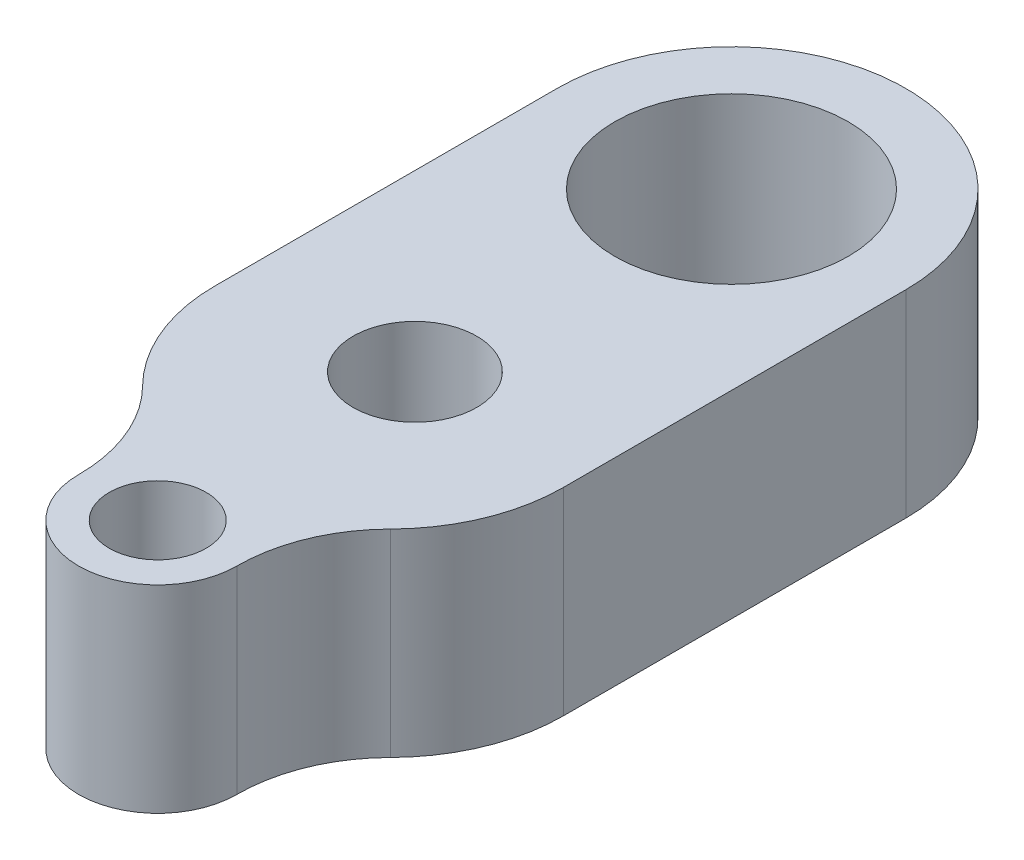
ISO-10303-21;
HEADER;
FILE_DESCRIPTION(('STEP AP214'),'2;1');
FILE_NAME('part.step','',(''),(''),'','','');
FILE_SCHEMA(('AUTOMOTIVE_DESIGN { 1 0 10303 214 1 1 1 1 }'));
ENDSEC;
DATA;
#1=APPLICATION_CONTEXT('core data for automotive mechanical design processes');
#2=APPLICATION_PROTOCOL_DEFINITION('international standard','automotive_design',2000,#1);
#3=PRODUCT_CONTEXT('',#1,'mechanical');
#4=PRODUCT('Part','Part','',(#3));
#5=PRODUCT_RELATED_PRODUCT_CATEGORY('part','',(#4));
#6=PRODUCT_DEFINITION_FORMATION('','',#4);
#7=PRODUCT_DEFINITION_CONTEXT('part definition',#1,'design');
#8=PRODUCT_DEFINITION('design','',#6,#7);
#9=PRODUCT_DEFINITION_SHAPE('','',#8);
#10=(LENGTH_UNIT() NAMED_UNIT(*) SI_UNIT(.MILLI.,.METRE.));
#11=(NAMED_UNIT(*) PLANE_ANGLE_UNIT() SI_UNIT($,.RADIAN.));
#12=(NAMED_UNIT(*) SI_UNIT($,.STERADIAN.) SOLID_ANGLE_UNIT());
#13=UNCERTAINTY_MEASURE_WITH_UNIT(LENGTH_MEASURE(1.E-05),#10,'distance_accuracy_value','');
#14=(GEOMETRIC_REPRESENTATION_CONTEXT(3) GLOBAL_UNCERTAINTY_ASSIGNED_CONTEXT((#13)) GLOBAL_UNIT_ASSIGNED_CONTEXT((#10,
#11,#12)) REPRESENTATION_CONTEXT('',''));
#15=CARTESIAN_POINT('',(0.,0.,0.));
#16=DIRECTION('',(0.,0.,1.));
#17=DIRECTION('',(1.,0.,0.));
#18=AXIS2_PLACEMENT_3D('',#15,#16,#17);
#19=CARTESIAN_POINT('',(-0.0197529120796733,1.27,2.27765411309233));
#20=DIRECTION('',(0.,-1.,0.));
#21=DIRECTION('',(0.,0.,-1.));
#22=AXIS2_PLACEMENT_3D('',#19,#20,#21);
#23=CYLINDRICAL_SURFACE('',#22,1.11918749999999);
#24=CARTESIAN_POINT('',(-0.0197529120796733,0.,2.27765411309233));
#25=DIRECTION('',(0.,1.,0.));
#26=DIRECTION('',(0.,0.,1.));
#27=AXIS2_PLACEMENT_3D('',#24,#25,#26);
#28=CIRCLE('',#27,1.11918749999999);
#29=CARTESIAN_POINT('',(-1.13894041207966,0.,2.27765411309233));
#30=VERTEX_POINT('',#29);
#31=CARTESIAN_POINT('',(-0.814965083132301,0.,3.06519348554681));
#32=VERTEX_POINT('',#31);
#33=EDGE_CURVE('E151',#30,#32,#28,.T.);
#34=ORIENTED_EDGE('',*,*,#33,.T.);
#35=DIRECTION('',(0.,-1.,0.));
#36=VECTOR('',#35,1.);
#37=CARTESIAN_POINT('',(-0.814965083132301,1.27,3.06519348554681));
#38=LINE('',#37,#36);
#39=CARTESIAN_POINT('',(-0.814965083132301,1.27,3.06519348554681));
#40=VERTEX_POINT('',#39);
#41=EDGE_CURVE('E11',#40,#32,#38,.T.);
#42=ORIENTED_EDGE('',*,*,#41,.F.);
#43=CARTESIAN_POINT('',(-0.0197529120796733,1.27,2.27765411309233));
#44=DIRECTION('',(0.,1.,0.));
#45=DIRECTION('',(0.,0.,1.));
#46=AXIS2_PLACEMENT_3D('',#43,#44,#45);
#47=CIRCLE('',#46,1.11918749999999);
#48=CARTESIAN_POINT('',(-1.13894041207966,1.27,2.27765411309233));
#49=VERTEX_POINT('',#48);
#50=EDGE_CURVE('E204',#49,#40,#47,.T.);
#51=ORIENTED_EDGE('',*,*,#50,.F.);
#52=DIRECTION('',(0.,-1.,0.));
#53=VECTOR('',#52,1.);
#54=CARTESIAN_POINT('',(-1.13894041207966,1.27,2.27765411309233));
#55=LINE('',#54,#53);
#56=EDGE_CURVE('E144',#49,#30,#55,.T.);
#57=ORIENTED_EDGE('',*,*,#56,.T.);
#58=EDGE_LOOP('',(#34,#42,#51,#57));
#59=FACE_BOUND('',#58,.T.);
#60=ADVANCED_FACE('F41',(#59),#23,.T.);
#61=CARTESIAN_POINT('',(-1.51994041207967,1.27,3.76336668807738));
#62=DIRECTION('',(0.,-1.,0.));
#63=DIRECTION('',(0.,0.,-1.));
#64=AXIS2_PLACEMENT_3D('',#61,#62,#63);
#65=CYLINDRICAL_SURFACE('',#64,0.9921875);
#66=CARTESIAN_POINT('',(-1.51994041207967,0.,3.76336668807738));
#67=DIRECTION('',(0.,1.,0.));
#68=DIRECTION('',(0.,0.,1.));
#69=AXIS2_PLACEMENT_3D('',#66,#67,#68);
#70=CIRCLE('',#69,0.9921875);
#71=CARTESIAN_POINT('',(-0.527752912079673,0.,3.76336668807738));
#72=VERTEX_POINT('',#71);
#73=EDGE_CURVE('E155',#32,#72,#70,.F.);
#74=ORIENTED_EDGE('',*,*,#73,.T.);
#75=DIRECTION('',(0.,-1.,0.));
#76=VECTOR('',#75,1.);
#77=CARTESIAN_POINT('',(-0.527752912079673,1.27,3.76336668807738));
#78=LINE('',#77,#76);
#79=CARTESIAN_POINT('',(-0.527752912079673,1.27,3.76336668807738));
#80=VERTEX_POINT('',#79);
#81=EDGE_CURVE('E50',#80,#72,#78,.T.);
#82=ORIENTED_EDGE('',*,*,#81,.F.);
#83=CARTESIAN_POINT('',(-1.51994041207967,1.27,3.76336668807738));
#84=DIRECTION('',(0.,1.,0.));
#85=DIRECTION('',(0.,0.,1.));
#86=AXIS2_PLACEMENT_3D('',#83,#84,#85);
#87=CIRCLE('',#86,0.9921875);
#88=EDGE_CURVE('E101',#40,#80,#87,.F.);
#89=ORIENTED_EDGE('',*,*,#88,.F.);
#90=ORIENTED_EDGE('',*,*,#41,.T.);
#91=EDGE_LOOP('',(#74,#82,#89,#90));
#92=FACE_BOUND('',#91,.T.);
#93=ADVANCED_FACE('F233',(#92),#65,.F.);
#94=CARTESIAN_POINT('',(-0.0197529120796733,1.27,3.76336668807738));
#95=DIRECTION('',(0.,-1.,0.));
#96=DIRECTION('',(0.,0.,-1.));
#97=AXIS2_PLACEMENT_3D('',#94,#95,#96);
#98=CYLINDRICAL_SURFACE('',#97,0.508);
#99=CARTESIAN_POINT('',(-0.0197529120796733,0.,3.76336668807738));
#100=DIRECTION('',(0.,1.,0.));
#101=DIRECTION('',(0.,0.,1.));
#102=AXIS2_PLACEMENT_3D('',#99,#100,#101);
#103=CIRCLE('',#102,0.508);
#104=CARTESIAN_POINT('',(0.488247087920327,0.,3.76336668807738));
#105=VERTEX_POINT('',#104);
#106=EDGE_CURVE('E158',#72,#105,#103,.T.);
#107=ORIENTED_EDGE('',*,*,#106,.T.);
#108=DIRECTION('',(0.,-1.,0.));
#109=VECTOR('',#108,1.);
#110=CARTESIAN_POINT('',(0.488247087920327,1.27,3.76336668807738));
#111=LINE('',#110,#109);
#112=CARTESIAN_POINT('',(0.488247087920327,1.27,3.76336668807738));
#113=VERTEX_POINT('',#112);
#114=EDGE_CURVE('E184',#113,#105,#111,.T.);
#115=ORIENTED_EDGE('',*,*,#114,.F.);
#116=CARTESIAN_POINT('',(-0.0197529120796733,1.27,3.76336668807738));
#117=DIRECTION('',(0.,1.,0.));
#118=DIRECTION('',(0.,0.,1.));
#119=AXIS2_PLACEMENT_3D('',#116,#117,#118);
#120=CIRCLE('',#119,0.508);
#121=EDGE_CURVE('E191',#80,#113,#120,.T.);
#122=ORIENTED_EDGE('',*,*,#121,.F.);
#123=ORIENTED_EDGE('',*,*,#81,.T.);
#124=EDGE_LOOP('',(#107,#115,#122,#123));
#125=FACE_BOUND('',#124,.T.);
#126=ADVANCED_FACE('F189',(#125),#98,.T.);
#127=CARTESIAN_POINT('',(1.48043458792033,1.27,3.76336668807738));
#128=DIRECTION('',(0.,-1.,0.));
#129=DIRECTION('',(0.,0.,-1.));
#130=AXIS2_PLACEMENT_3D('',#127,#128,#129);
#131=CYLINDRICAL_SURFACE('',#130,0.9921875);
#132=CARTESIAN_POINT('',(1.48043458792033,0.,3.76336668807738));
#133=DIRECTION('',(0.,1.,0.));
#134=DIRECTION('',(0.,0.,1.));
#135=AXIS2_PLACEMENT_3D('',#132,#133,#134);
#136=CIRCLE('',#135,0.9921875);
#137=CARTESIAN_POINT('',(0.775459258972955,0.,3.06519348554681));
#138=VERTEX_POINT('',#137);
#139=EDGE_CURVE('E162',#138,#105,#136,.T.);
#140=ORIENTED_EDGE('',*,*,#139,.F.);
#141=DIRECTION('',(0.,-1.,0.));
#142=VECTOR('',#141,1.);
#143=CARTESIAN_POINT('',(0.775459258972955,1.27,3.06519348554681));
#144=LINE('',#143,#142);
#145=CARTESIAN_POINT('',(0.775459258972955,1.27,3.06519348554681));
#146=VERTEX_POINT('',#145);
#147=EDGE_CURVE('E182',#146,#138,#144,.T.);
#148=ORIENTED_EDGE('',*,*,#147,.F.);
#149=CARTESIAN_POINT('',(1.48043458792033,1.27,3.76336668807738));
#150=DIRECTION('',(0.,1.,0.));
#151=DIRECTION('',(0.,0.,1.));
#152=AXIS2_PLACEMENT_3D('',#149,#150,#151);
#153=CIRCLE('',#152,0.9921875);
#154=EDGE_CURVE('E136',#146,#113,#153,.T.);
#155=ORIENTED_EDGE('',*,*,#154,.T.);
#156=ORIENTED_EDGE('',*,*,#114,.T.);
#157=EDGE_LOOP('',(#140,#148,#155,#156));
#158=FACE_BOUND('',#157,.T.);
#159=ADVANCED_FACE('F199',(#158),#131,.F.);
#160=CARTESIAN_POINT('',(-0.0197529120796733,1.27,2.27765411309233));
#161=DIRECTION('',(0.,-1.,0.));
#162=DIRECTION('',(0.,0.,-1.));
#163=AXIS2_PLACEMENT_3D('',#160,#161,#162);
#164=CYLINDRICAL_SURFACE('',#163,1.11918749999999);
#165=CARTESIAN_POINT('',(-0.0197529120796733,0.,2.27765411309233));
#166=DIRECTION('',(0.,1.,0.));
#167=DIRECTION('',(0.,0.,1.));
#168=AXIS2_PLACEMENT_3D('',#165,#166,#167);
#169=CIRCLE('',#168,1.11918749999999);
#170=CARTESIAN_POINT('',(1.09943458792032,0.,2.27765411309233));
#171=VERTEX_POINT('',#170);
#172=EDGE_CURVE('E166',#171,#138,#169,.F.);
#173=ORIENTED_EDGE('',*,*,#172,.F.);
#174=DIRECTION('',(0.,-1.,0.));
#175=VECTOR('',#174,1.);
#176=CARTESIAN_POINT('',(1.09943458792032,1.27,2.27765411309233));
#177=LINE('',#176,#175);
#178=CARTESIAN_POINT('',(1.09943458792032,1.27,2.27765411309233));
#179=VERTEX_POINT('',#178);
#180=EDGE_CURVE('E123',#179,#171,#177,.T.);
#181=ORIENTED_EDGE('',*,*,#180,.F.);
#182=CARTESIAN_POINT('',(-0.0197529120796733,1.27,2.27765411309233));
#183=DIRECTION('',(0.,1.,0.));
#184=DIRECTION('',(0.,0.,1.));
#185=AXIS2_PLACEMENT_3D('',#182,#183,#184);
#186=CIRCLE('',#185,1.11918749999999);
#187=EDGE_CURVE('E134',#179,#146,#186,.F.);
#188=ORIENTED_EDGE('',*,*,#187,.T.);
#189=ORIENTED_EDGE('',*,*,#147,.T.);
#190=EDGE_LOOP('',(#173,#181,#188,#189));
#191=FACE_BOUND('',#190,.T.);
#192=ADVANCED_FACE('F245',(#191),#164,.T.);
#193=CARTESIAN_POINT('',(1.09943458792032,1.27,0.));
#194=DIRECTION('',(1.,0.,0.));
#195=DIRECTION('',(0.,0.,-1.));
#196=AXIS2_PLACEMENT_3D('',#193,#194,#195);
#197=PLANE('',#196);
#198=DIRECTION('',(0.,0.,1.));
#199=VECTOR('',#198,1.);
#200=CARTESIAN_POINT('',(1.09943458792032,0.,0.));
#201=LINE('',#200,#199);
#202=CARTESIAN_POINT('',(1.09943458792032,0.,0.080366688077379));
#203=VERTEX_POINT('',#202);
#204=EDGE_CURVE('E122',#203,#171,#201,.T.);
#205=ORIENTED_EDGE('',*,*,#204,.F.);
#206=DIRECTION('',(0.,-1.,0.));
#207=VECTOR('',#206,1.);
#208=CARTESIAN_POINT('',(1.09943458792032,1.27,0.080366688077379));
#209=LINE('',#208,#207);
#210=CARTESIAN_POINT('',(1.09943458792032,1.27,0.080366688077379));
#211=VERTEX_POINT('',#210);
#212=EDGE_CURVE('E116',#211,#203,#209,.T.);
#213=ORIENTED_EDGE('',*,*,#212,.F.);
#214=DIRECTION('',(0.,0.,1.));
#215=VECTOR('',#214,1.);
#216=CARTESIAN_POINT('',(1.09943458792032,1.27,0.));
#217=LINE('',#216,#215);
#218=EDGE_CURVE('E120',#211,#179,#217,.T.);
#219=ORIENTED_EDGE('',*,*,#218,.T.);
#220=ORIENTED_EDGE('',*,*,#180,.T.);
#221=EDGE_LOOP('',(#205,#213,#219,#220));
#222=FACE_BOUND('',#221,.T.);
#223=ADVANCED_FACE('F118',(#222),#197,.T.);
#224=CARTESIAN_POINT('',(-0.0197529120796736,1.27,0.080366688077379));
#225=DIRECTION('',(0.,-1.,0.));
#226=DIRECTION('',(0.,0.,-1.));
#227=AXIS2_PLACEMENT_3D('',#224,#225,#226);
#228=CYLINDRICAL_SURFACE('',#227,1.11918749999999);
#229=CARTESIAN_POINT('',(-0.0197529120796736,0.,0.080366688077379));
#230=DIRECTION('',(0.,1.,0.));
#231=DIRECTION('',(0.,0.,1.));
#232=AXIS2_PLACEMENT_3D('',#229,#230,#231);
#233=CIRCLE('',#232,1.11918749999999);
#234=CARTESIAN_POINT('',(-1.13894041207966,0.,0.080366688077379));
#235=VERTEX_POINT('',#234);
#236=EDGE_CURVE('E87',#203,#235,#233,.T.);
#237=ORIENTED_EDGE('',*,*,#236,.T.);
#238=DIRECTION('',(0.,-1.,0.));
#239=VECTOR('',#238,1.);
#240=CARTESIAN_POINT('',(-1.13894041207966,1.27,0.080366688077379));
#241=LINE('',#240,#239);
#242=CARTESIAN_POINT('',(-1.13894041207966,1.27,0.080366688077379));
#243=VERTEX_POINT('',#242);
#244=EDGE_CURVE('E124',#243,#235,#241,.T.);
#245=ORIENTED_EDGE('',*,*,#244,.F.);
#246=CARTESIAN_POINT('',(-0.0197529120796736,1.27,0.080366688077379));
#247=DIRECTION('',(0.,1.,0.));
#248=DIRECTION('',(0.,0.,1.));
#249=AXIS2_PLACEMENT_3D('',#246,#247,#248);
#250=CIRCLE('',#249,1.11918749999999);
#251=EDGE_CURVE('E126',#211,#243,#250,.T.);
#252=ORIENTED_EDGE('',*,*,#251,.F.);
#253=ORIENTED_EDGE('',*,*,#212,.T.);
#254=EDGE_LOOP('',(#237,#245,#252,#253));
#255=FACE_BOUND('',#254,.T.);
#256=ADVANCED_FACE('F127',(#255),#228,.T.);
#257=CARTESIAN_POINT('',(-1.13894041207966,1.27,0.));
#258=DIRECTION('',(1.,0.,0.));
#259=DIRECTION('',(0.,0.,-1.));
#260=AXIS2_PLACEMENT_3D('',#257,#258,#259);
#261=PLANE('',#260);
#262=DIRECTION('',(0.,0.,1.));
#263=VECTOR('',#262,1.);
#264=CARTESIAN_POINT('',(-1.13894041207966,0.,0.));
#265=LINE('',#264,#263);
#266=EDGE_CURVE('E93',#235,#30,#265,.T.);
#267=ORIENTED_EDGE('',*,*,#266,.T.);
#268=ORIENTED_EDGE('',*,*,#56,.F.);
#269=DIRECTION('',(0.,0.,1.));
#270=VECTOR('',#269,1.);
#271=CARTESIAN_POINT('',(-1.13894041207966,1.27,0.));
#272=LINE('',#271,#270);
#273=EDGE_CURVE('E58',#243,#49,#272,.T.);
#274=ORIENTED_EDGE('',*,*,#273,.F.);
#275=ORIENTED_EDGE('',*,*,#244,.T.);
#276=EDGE_LOOP('',(#267,#268,#274,#275));
#277=FACE_BOUND('',#276,.T.);
#278=ADVANCED_FACE('F223',(#277),#261,.F.);
#279=CARTESIAN_POINT('',(-0.0197529120796735,1.27,0.0803666880773067));
#280=DIRECTION('',(0.,-1.,0.));
#281=DIRECTION('',(0.,0.,-1.));
#282=AXIS2_PLACEMENT_3D('',#279,#280,#281);
#283=CYLINDRICAL_SURFACE('',#282,0.749300000000012);
#284=CARTESIAN_POINT('',(-0.0197529120796735,1.27,0.0803666880773067));
#285=DIRECTION('',(0.,1.,0.));
#286=DIRECTION('',(0.,0.,1.));
#287=AXIS2_PLACEMENT_3D('',#284,#285,#286);
#288=CIRCLE('',#287,0.749300000000012);
#289=CARTESIAN_POINT('',(-0.0197529120796735,1.27,0.829666688077318));
#290=VERTEX_POINT('',#289);
#291=EDGE_CURVE('E206',#290,#290,#288,.T.);
#292=ORIENTED_EDGE('',*,*,#291,.T.);
#293=EDGE_LOOP('',(#292));
#294=FACE_BOUND('',#293,.T.);
#295=CARTESIAN_POINT('',(-0.0197529120796735,0.,0.0803666880773067));
#296=DIRECTION('',(0.,1.,0.));
#297=DIRECTION('',(0.,0.,1.));
#298=AXIS2_PLACEMENT_3D('',#295,#296,#297);
#299=CIRCLE('',#298,0.749300000000012);
#300=CARTESIAN_POINT('',(-0.0197529120796735,0.,0.829666688077318));
#301=VERTEX_POINT('',#300);
#302=EDGE_CURVE('E148',#301,#301,#299,.T.);
#303=ORIENTED_EDGE('',*,*,#302,.F.);
#304=EDGE_LOOP('',(#303));
#305=FACE_BOUND('',#304,.T.);
#306=ADVANCED_FACE('F220',(#294,#305),#283,.F.);
#307=CARTESIAN_POINT('',(-0.0197529120796733,1.27,2.11236668807738));
#308=DIRECTION('',(0.,-1.,0.));
#309=DIRECTION('',(0.,0.,-1.));
#310=AXIS2_PLACEMENT_3D('',#307,#308,#309);
#311=CYLINDRICAL_SURFACE('',#310,0.396875);
#312=CARTESIAN_POINT('',(-0.0197529120796733,1.27,2.11236668807738));
#313=DIRECTION('',(0.,1.,0.));
#314=DIRECTION('',(0.,0.,1.));
#315=AXIS2_PLACEMENT_3D('',#312,#313,#314);
#316=CIRCLE('',#315,0.396875);
#317=CARTESIAN_POINT('',(-0.0197529120796733,1.27,2.50924168807738));
#318=VERTEX_POINT('',#317);
#319=EDGE_CURVE('E178',#318,#318,#316,.T.);
#320=ORIENTED_EDGE('',*,*,#319,.T.);
#321=EDGE_LOOP('',(#320));
#322=FACE_BOUND('',#321,.T.);
#323=CARTESIAN_POINT('',(-0.0197529120796733,0.,2.11236668807738));
#324=DIRECTION('',(0.,1.,0.));
#325=DIRECTION('',(0.,0.,1.));
#326=AXIS2_PLACEMENT_3D('',#323,#324,#325);
#327=CIRCLE('',#326,0.396875);
#328=CARTESIAN_POINT('',(-0.0197529120796733,0.,2.50924168807738));
#329=VERTEX_POINT('',#328);
#330=EDGE_CURVE('E145',#329,#329,#327,.T.);
#331=ORIENTED_EDGE('',*,*,#330,.F.);
#332=EDGE_LOOP('',(#331));
#333=FACE_BOUND('',#332,.T.);
#334=ADVANCED_FACE('F43',(#322,#333),#311,.F.);
#335=CARTESIAN_POINT('',(-0.0197529120796733,1.27,3.76336668807738));
#336=DIRECTION('',(0.,-1.,0.));
#337=DIRECTION('',(0.,0.,-1.));
#338=AXIS2_PLACEMENT_3D('',#335,#336,#337);
#339=CYLINDRICAL_SURFACE('',#338,0.31115);
#340=CARTESIAN_POINT('',(-0.0197529120796733,1.27,3.76336668807738));
#341=DIRECTION('',(0.,1.,0.));
#342=DIRECTION('',(0.,0.,1.));
#343=AXIS2_PLACEMENT_3D('',#340,#341,#342);
#344=CIRCLE('',#343,0.31115);
#345=CARTESIAN_POINT('',(-0.0197529120796733,1.27,4.07451668807738));
#346=VERTEX_POINT('',#345);
#347=EDGE_CURVE('E141',#346,#346,#344,.T.);
#348=ORIENTED_EDGE('',*,*,#347,.T.);
#349=EDGE_LOOP('',(#348));
#350=FACE_BOUND('',#349,.T.);
#351=CARTESIAN_POINT('',(-0.0197529120796733,0.,3.76336668807738));
#352=DIRECTION('',(0.,1.,0.));
#353=DIRECTION('',(0.,0.,1.));
#354=AXIS2_PLACEMENT_3D('',#351,#352,#353);
#355=CIRCLE('',#354,0.31115);
#356=CARTESIAN_POINT('',(-0.0197529120796733,0.,4.07451668807738));
#357=VERTEX_POINT('',#356);
#358=EDGE_CURVE('E175',#357,#357,#355,.T.);
#359=ORIENTED_EDGE('',*,*,#358,.F.);
#360=EDGE_LOOP('',(#359));
#361=FACE_BOUND('',#360,.T.);
#362=ADVANCED_FACE('F216',(#350,#361),#339,.F.);
#363=CARTESIAN_POINT('',(0.,1.27,0.));
#364=DIRECTION('',(0.,1.,0.));
#365=DIRECTION('',(0.,0.,1.));
#366=AXIS2_PLACEMENT_3D('',#363,#364,#365);
#367=PLANE('',#366);
#368=ORIENTED_EDGE('',*,*,#319,.F.);
#369=EDGE_LOOP('',(#368));
#370=FACE_BOUND('',#369,.T.);
#371=ORIENTED_EDGE('',*,*,#291,.F.);
#372=EDGE_LOOP('',(#371));
#373=FACE_BOUND('',#372,.T.);
#374=ORIENTED_EDGE('',*,*,#50,.T.);
#375=ORIENTED_EDGE('',*,*,#88,.T.);
#376=ORIENTED_EDGE('',*,*,#121,.T.);
#377=ORIENTED_EDGE('',*,*,#154,.F.);
#378=ORIENTED_EDGE('',*,*,#187,.F.);
#379=ORIENTED_EDGE('',*,*,#218,.F.);
#380=ORIENTED_EDGE('',*,*,#251,.T.);
#381=ORIENTED_EDGE('',*,*,#273,.T.);
#382=EDGE_LOOP('',(#374,#375,#376,#377,#378,#379,#380,#381));
#383=FACE_BOUND('',#382,.T.);
#384=ORIENTED_EDGE('',*,*,#347,.F.);
#385=EDGE_LOOP('',(#384));
#386=FACE_BOUND('',#385,.T.);
#387=ADVANCED_FACE('F130',(#370,#373,#383,#386),#367,.T.);
#388=CARTESIAN_POINT('',(0.,0.,0.));
#389=DIRECTION('',(0.,1.,0.));
#390=DIRECTION('',(0.,0.,1.));
#391=AXIS2_PLACEMENT_3D('',#388,#389,#390);
#392=PLANE('',#391);
#393=ORIENTED_EDGE('',*,*,#330,.T.);
#394=EDGE_LOOP('',(#393));
#395=FACE_BOUND('',#394,.T.);
#396=ORIENTED_EDGE('',*,*,#302,.T.);
#397=EDGE_LOOP('',(#396));
#398=FACE_BOUND('',#397,.T.);
#399=ORIENTED_EDGE('',*,*,#33,.F.);
#400=ORIENTED_EDGE('',*,*,#266,.F.);
#401=ORIENTED_EDGE('',*,*,#236,.F.);
#402=ORIENTED_EDGE('',*,*,#204,.T.);
#403=ORIENTED_EDGE('',*,*,#172,.T.);
#404=ORIENTED_EDGE('',*,*,#139,.T.);
#405=ORIENTED_EDGE('',*,*,#106,.F.);
#406=ORIENTED_EDGE('',*,*,#73,.F.);
#407=EDGE_LOOP('',(#399,#400,#401,#402,#403,#404,#405,#406));
#408=FACE_BOUND('',#407,.T.);
#409=ORIENTED_EDGE('',*,*,#358,.T.);
#410=EDGE_LOOP('',(#409));
#411=FACE_BOUND('',#410,.T.);
#412=ADVANCED_FACE('F194',(#395,#398,#408,#411),#392,.F.);
#413=CLOSED_SHELL('',(#60,#93,#126,#159,#192,#223,#256,#278,#306,#334,#362,#387,#412));
#414=MANIFOLD_SOLID_BREP('B2',#413);
#415=ADVANCED_BREP_SHAPE_REPRESENTATION('',(#18,#414),#14);
#416=SHAPE_DEFINITION_REPRESENTATION(#9,#415);
ENDSEC;
END-ISO-10303-21;
